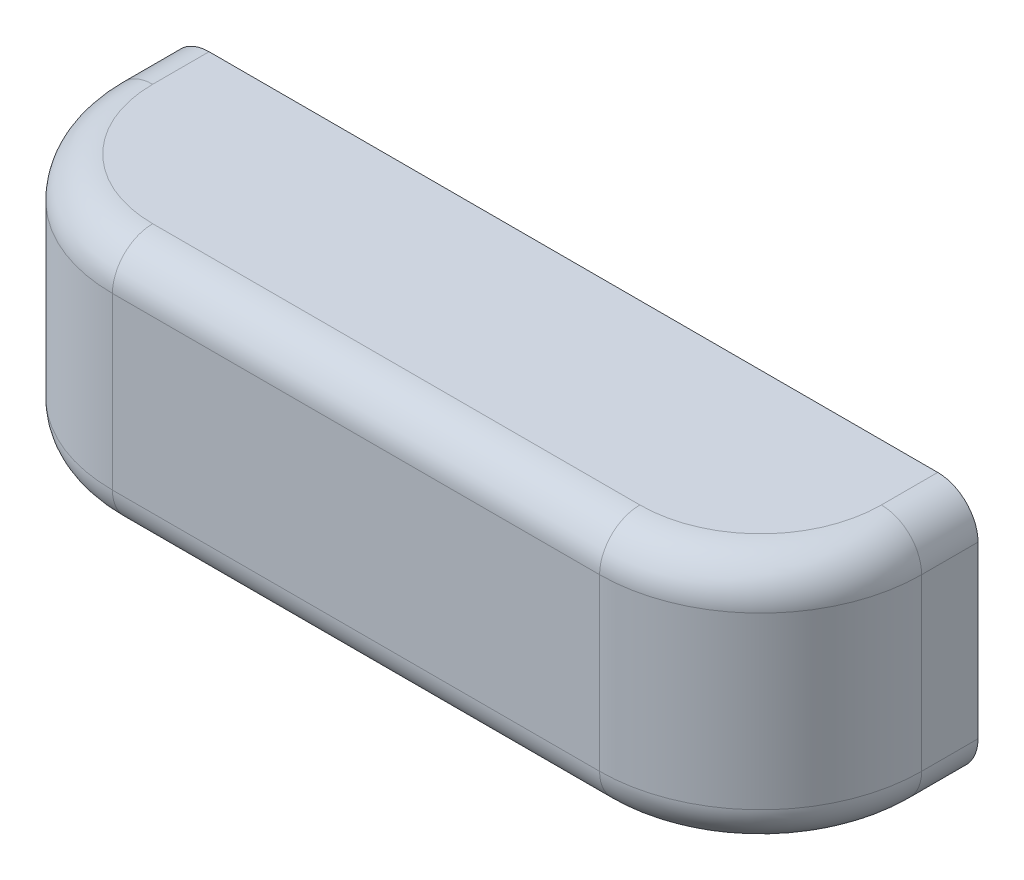
ISO-10303-21;
HEADER;
FILE_DESCRIPTION(('STEP AP214'),'2;1');
FILE_NAME('part.step','',(''),(''),'','','');
FILE_SCHEMA(('AUTOMOTIVE_DESIGN { 1 0 10303 214 1 1 1 1 }'));
ENDSEC;
DATA;
#1=APPLICATION_CONTEXT('core data for automotive mechanical design processes');
#2=APPLICATION_PROTOCOL_DEFINITION('international standard','automotive_design',2000,#1);
#3=PRODUCT_CONTEXT('',#1,'mechanical');
#4=PRODUCT('Part','Part','',(#3));
#5=PRODUCT_RELATED_PRODUCT_CATEGORY('part','',(#4));
#6=PRODUCT_DEFINITION_FORMATION('','',#4);
#7=PRODUCT_DEFINITION_CONTEXT('part definition',#1,'design');
#8=PRODUCT_DEFINITION('design','',#6,#7);
#9=PRODUCT_DEFINITION_SHAPE('','',#8);
#10=(LENGTH_UNIT() NAMED_UNIT(*) SI_UNIT(.MILLI.,.METRE.));
#11=(NAMED_UNIT(*) PLANE_ANGLE_UNIT() SI_UNIT($,.RADIAN.));
#12=(NAMED_UNIT(*) SI_UNIT($,.STERADIAN.) SOLID_ANGLE_UNIT());
#13=UNCERTAINTY_MEASURE_WITH_UNIT(LENGTH_MEASURE(1.E-05),#10,'distance_accuracy_value','');
#14=(GEOMETRIC_REPRESENTATION_CONTEXT(3) GLOBAL_UNCERTAINTY_ASSIGNED_CONTEXT((#13)) GLOBAL_UNIT_ASSIGNED_CONTEXT((#10,
#11,#12)) REPRESENTATION_CONTEXT('',''));
#15=CARTESIAN_POINT('',(0.,0.,0.));
#16=DIRECTION('',(0.,0.,1.));
#17=DIRECTION('',(1.,0.,0.));
#18=AXIS2_PLACEMENT_3D('',#15,#16,#17);
#19=CARTESIAN_POINT('',(50.25,15.575,27.));
#20=DIRECTION('',(-1.,0.,0.));
#21=DIRECTION('',(0.,0.,1.));
#22=AXIS2_PLACEMENT_3D('',#19,#20,#21);
#23=PLANE('',#22);
#24=DIRECTION('',(0.,1.,0.));
#25=VECTOR('',#24,1.);
#26=CARTESIAN_POINT('',(50.25,15.575,0.));
#27=LINE('',#26,#25);
#28=CARTESIAN_POINT('',(50.25,-10.575,0.));
#29=VERTEX_POINT('',#28);
#30=CARTESIAN_POINT('',(50.25,10.575,0.));
#31=VERTEX_POINT('',#30);
#32=EDGE_CURVE('E167',#29,#31,#27,.T.);
#33=ORIENTED_EDGE('',*,*,#32,.T.);
#34=DIRECTION('',(0.,0.,-1.));
#35=VECTOR('',#34,1.);
#36=CARTESIAN_POINT('',(50.25,10.575,27.));
#37=LINE('',#36,#35);
#38=CARTESIAN_POINT('',(50.25,10.575,7.));
#39=VERTEX_POINT('',#38);
#40=EDGE_CURVE('E142',#31,#39,#37,.F.);
#41=ORIENTED_EDGE('',*,*,#40,.T.);
#42=DIRECTION('',(0.,1.,0.));
#43=VECTOR('',#42,1.);
#44=CARTESIAN_POINT('',(50.25,-15.575,7.));
#45=LINE('',#44,#43);
#46=CARTESIAN_POINT('',(50.25,-10.575,7.));
#47=VERTEX_POINT('',#46);
#48=EDGE_CURVE('E187',#39,#47,#45,.F.);
#49=ORIENTED_EDGE('',*,*,#48,.T.);
#50=DIRECTION('',(0.,0.,-1.));
#51=VECTOR('',#50,1.);
#52=CARTESIAN_POINT('',(50.25,-10.575,27.));
#53=LINE('',#52,#51);
#54=EDGE_CURVE('E148',#47,#29,#53,.T.);
#55=ORIENTED_EDGE('',*,*,#54,.T.);
#56=EDGE_LOOP('',(#33,#41,#49,#55));
#57=FACE_BOUND('',#56,.T.);
#58=ADVANCED_FACE('F45',(#57),#23,.F.);
#59=CARTESIAN_POINT('',(-50.25,15.575,27.));
#60=DIRECTION('',(0.,-1.,0.));
#61=DIRECTION('',(0.,0.,-1.));
#62=AXIS2_PLACEMENT_3D('',#59,#60,#61);
#63=PLANE('',#62);
#64=CARTESIAN_POINT('',(30.25,15.575,7.));
#65=DIRECTION('',(0.,-1.,0.));
#66=DIRECTION('',(0.,0.,-1.));
#67=AXIS2_PLACEMENT_3D('',#64,#65,#66);
#68=CIRCLE('',#67,15.);
#69=CARTESIAN_POINT('',(30.25,15.575,22.));
#70=VERTEX_POINT('',#69);
#71=CARTESIAN_POINT('',(45.25,15.575,7.));
#72=VERTEX_POINT('',#71);
#73=EDGE_CURVE('E157',#70,#72,#68,.F.);
#74=ORIENTED_EDGE('',*,*,#73,.T.);
#75=DIRECTION('',(0.,0.,-1.));
#76=VECTOR('',#75,1.);
#77=CARTESIAN_POINT('',(45.25,15.575,27.));
#78=LINE('',#77,#76);
#79=CARTESIAN_POINT('',(45.25,15.575,0.));
#80=VERTEX_POINT('',#79);
#81=EDGE_CURVE('E141',#72,#80,#78,.T.);
#82=ORIENTED_EDGE('',*,*,#81,.T.);
#83=DIRECTION('',(-1.,0.,0.));
#84=VECTOR('',#83,1.);
#85=CARTESIAN_POINT('',(-50.25,15.575,0.));
#86=LINE('',#85,#84);
#87=CARTESIAN_POINT('',(-45.25,15.575,0.));
#88=VERTEX_POINT('',#87);
#89=EDGE_CURVE('E154',#80,#88,#86,.T.);
#90=ORIENTED_EDGE('',*,*,#89,.T.);
#91=DIRECTION('',(0.,0.,-1.));
#92=VECTOR('',#91,1.);
#93=CARTESIAN_POINT('',(-45.25,15.575,27.));
#94=LINE('',#93,#92);
#95=CARTESIAN_POINT('',(-45.25,15.575,7.));
#96=VERTEX_POINT('',#95);
#97=EDGE_CURVE('E201',#88,#96,#94,.F.);
#98=ORIENTED_EDGE('',*,*,#97,.T.);
#99=CARTESIAN_POINT('',(-30.25,15.575,7.));
#100=DIRECTION('',(0.,-1.,0.));
#101=DIRECTION('',(0.,0.,-1.));
#102=AXIS2_PLACEMENT_3D('',#99,#100,#101);
#103=CIRCLE('',#102,15.);
#104=CARTESIAN_POINT('',(-30.25,15.575,22.));
#105=VERTEX_POINT('',#104);
#106=EDGE_CURVE('E198',#96,#105,#103,.F.);
#107=ORIENTED_EDGE('',*,*,#106,.T.);
#108=DIRECTION('',(-1.,0.,0.));
#109=VECTOR('',#108,1.);
#110=CARTESIAN_POINT('',(30.25,15.575,22.));
#111=LINE('',#110,#109);
#112=EDGE_CURVE('E195',#105,#70,#111,.F.);
#113=ORIENTED_EDGE('',*,*,#112,.T.);
#114=EDGE_LOOP('',(#74,#82,#90,#98,#107,#113));
#115=FACE_BOUND('',#114,.T.);
#116=ADVANCED_FACE('F153',(#115),#63,.F.);
#117=CARTESIAN_POINT('',(-50.25,15.575,27.));
#118=DIRECTION('',(1.,0.,0.));
#119=DIRECTION('',(0.,1.,0.));
#120=AXIS2_PLACEMENT_3D('',#117,#118,#119);
#121=PLANE('',#120);
#122=DIRECTION('',(0.,-1.,0.));
#123=VECTOR('',#122,1.);
#124=CARTESIAN_POINT('',(-50.25,15.575,7.));
#125=LINE('',#124,#123);
#126=CARTESIAN_POINT('',(-50.25,-10.575,7.));
#127=VERTEX_POINT('',#126);
#128=CARTESIAN_POINT('',(-50.25,10.575,7.));
#129=VERTEX_POINT('',#128);
#130=EDGE_CURVE('E191',#127,#129,#125,.F.);
#131=ORIENTED_EDGE('',*,*,#130,.T.);
#132=DIRECTION('',(0.,0.,-1.));
#133=VECTOR('',#132,1.);
#134=CARTESIAN_POINT('',(-50.25,10.575,27.));
#135=LINE('',#134,#133);
#136=CARTESIAN_POINT('',(-50.25,10.575,0.));
#137=VERTEX_POINT('',#136);
#138=EDGE_CURVE('E226',#129,#137,#135,.T.);
#139=ORIENTED_EDGE('',*,*,#138,.T.);
#140=DIRECTION('',(0.,-1.,0.));
#141=VECTOR('',#140,1.);
#142=CARTESIAN_POINT('',(-50.25,15.575,0.));
#143=LINE('',#142,#141);
#144=CARTESIAN_POINT('',(-50.25,-10.575,0.));
#145=VERTEX_POINT('',#144);
#146=EDGE_CURVE('E166',#137,#145,#143,.T.);
#147=ORIENTED_EDGE('',*,*,#146,.T.);
#148=DIRECTION('',(0.,0.,-1.));
#149=VECTOR('',#148,1.);
#150=CARTESIAN_POINT('',(-50.25,-10.575,27.));
#151=LINE('',#150,#149);
#152=EDGE_CURVE('E223',#145,#127,#151,.F.);
#153=ORIENTED_EDGE('',*,*,#152,.T.);
#154=EDGE_LOOP('',(#131,#139,#147,#153));
#155=FACE_BOUND('',#154,.T.);
#156=ADVANCED_FACE('F296',(#155),#121,.F.);
#157=CARTESIAN_POINT('',(-50.25,-15.575,27.));
#158=DIRECTION('',(0.,1.,0.));
#159=DIRECTION('',(0.,0.,1.));
#160=AXIS2_PLACEMENT_3D('',#157,#158,#159);
#161=PLANE('',#160);
#162=CARTESIAN_POINT('',(-30.25,-15.575,7.));
#163=DIRECTION('',(0.,1.,0.));
#164=DIRECTION('',(0.,0.,1.));
#165=AXIS2_PLACEMENT_3D('',#162,#163,#164);
#166=CIRCLE('',#165,15.);
#167=CARTESIAN_POINT('',(-30.25,-15.575,22.));
#168=VERTEX_POINT('',#167);
#169=CARTESIAN_POINT('',(-45.25,-15.575,7.));
#170=VERTEX_POINT('',#169);
#171=EDGE_CURVE('E63',#168,#170,#166,.F.);
#172=ORIENTED_EDGE('',*,*,#171,.T.);
#173=DIRECTION('',(0.,0.,-1.));
#174=VECTOR('',#173,1.);
#175=CARTESIAN_POINT('',(-45.25,-15.575,27.));
#176=LINE('',#175,#174);
#177=CARTESIAN_POINT('',(-45.25,-15.575,0.));
#178=VERTEX_POINT('',#177);
#179=EDGE_CURVE('E245',#170,#178,#176,.T.);
#180=ORIENTED_EDGE('',*,*,#179,.T.);
#181=DIRECTION('',(1.,0.,0.));
#182=VECTOR('',#181,1.);
#183=CARTESIAN_POINT('',(-50.25,-15.575,0.));
#184=LINE('',#183,#182);
#185=CARTESIAN_POINT('',(45.25,-15.575,0.));
#186=VERTEX_POINT('',#185);
#187=EDGE_CURVE('E172',#178,#186,#184,.T.);
#188=ORIENTED_EDGE('',*,*,#187,.T.);
#189=DIRECTION('',(0.,0.,-1.));
#190=VECTOR('',#189,1.);
#191=CARTESIAN_POINT('',(45.25,-15.575,27.));
#192=LINE('',#191,#190);
#193=CARTESIAN_POINT('',(45.25,-15.575,7.));
#194=VERTEX_POINT('',#193);
#195=EDGE_CURVE('E70',#186,#194,#192,.F.);
#196=ORIENTED_EDGE('',*,*,#195,.T.);
#197=CARTESIAN_POINT('',(30.25,-15.575,7.));
#198=DIRECTION('',(0.,1.,0.));
#199=DIRECTION('',(0.,0.,1.));
#200=AXIS2_PLACEMENT_3D('',#197,#198,#199);
#201=CIRCLE('',#200,15.);
#202=CARTESIAN_POINT('',(30.25,-15.575,22.));
#203=VERTEX_POINT('',#202);
#204=EDGE_CURVE('E238',#194,#203,#201,.F.);
#205=ORIENTED_EDGE('',*,*,#204,.T.);
#206=DIRECTION('',(1.,0.,0.));
#207=VECTOR('',#206,1.);
#208=CARTESIAN_POINT('',(-30.25,-15.575,22.));
#209=LINE('',#208,#207);
#210=EDGE_CURVE('E235',#203,#168,#209,.F.);
#211=ORIENTED_EDGE('',*,*,#210,.T.);
#212=EDGE_LOOP('',(#172,#180,#188,#196,#205,#211));
#213=FACE_BOUND('',#212,.T.);
#214=ADVANCED_FACE('F290',(#213),#161,.F.);
#215=CARTESIAN_POINT('',(0.,0.,27.));
#216=DIRECTION('',(0.,0.,1.));
#217=DIRECTION('',(1.,0.,0.));
#218=AXIS2_PLACEMENT_3D('',#215,#216,#217);
#219=PLANE('',#218);
#220=DIRECTION('',(0.,1.,0.));
#221=VECTOR('',#220,1.);
#222=CARTESIAN_POINT('',(30.25,15.575,27.));
#223=LINE('',#222,#221);
#224=CARTESIAN_POINT('',(30.25,-10.575,27.));
#225=VERTEX_POINT('',#224);
#226=CARTESIAN_POINT('',(30.25,10.575,27.));
#227=VERTEX_POINT('',#226);
#228=EDGE_CURVE('E183',#225,#227,#223,.T.);
#229=ORIENTED_EDGE('',*,*,#228,.T.);
#230=DIRECTION('',(-1.,0.,0.));
#231=VECTOR('',#230,1.);
#232=CARTESIAN_POINT('',(-30.25,10.575,27.));
#233=LINE('',#232,#231);
#234=CARTESIAN_POINT('',(-30.25,10.575,27.));
#235=VERTEX_POINT('',#234);
#236=EDGE_CURVE('E11',#227,#235,#233,.T.);
#237=ORIENTED_EDGE('',*,*,#236,.T.);
#238=DIRECTION('',(0.,-1.,0.));
#239=VECTOR('',#238,1.);
#240=CARTESIAN_POINT('',(-30.25,-15.575,27.));
#241=LINE('',#240,#239);
#242=CARTESIAN_POINT('',(-30.25,-10.575,27.));
#243=VERTEX_POINT('',#242);
#244=EDGE_CURVE('E179',#235,#243,#241,.T.);
#245=ORIENTED_EDGE('',*,*,#244,.T.);
#246=DIRECTION('',(1.,0.,0.));
#247=VECTOR('',#246,1.);
#248=CARTESIAN_POINT('',(30.25,-10.575,27.));
#249=LINE('',#248,#247);
#250=EDGE_CURVE('E55',#243,#225,#249,.T.);
#251=ORIENTED_EDGE('',*,*,#250,.T.);
#252=EDGE_LOOP('',(#229,#237,#245,#251));
#253=FACE_BOUND('',#252,.T.);
#254=ADVANCED_FACE('F319',(#253),#219,.T.);
#255=CARTESIAN_POINT('',(0.,0.,0.));
#256=DIRECTION('',(0.,0.,1.));
#257=DIRECTION('',(1.,0.,0.));
#258=AXIS2_PLACEMENT_3D('',#255,#256,#257);
#259=PLANE('',#258);
#260=ORIENTED_EDGE('',*,*,#89,.F.);
#261=CARTESIAN_POINT('',(45.25,10.575,0.));
#262=DIRECTION('',(0.,0.,1.));
#263=DIRECTION('',(1.,0.,0.));
#264=AXIS2_PLACEMENT_3D('',#261,#262,#263);
#265=CIRCLE('',#264,5.);
#266=EDGE_CURVE('E137',#80,#31,#265,.F.);
#267=ORIENTED_EDGE('',*,*,#266,.T.);
#268=ORIENTED_EDGE('',*,*,#32,.F.);
#269=CARTESIAN_POINT('',(45.25,-10.575,0.));
#270=DIRECTION('',(0.,0.,1.));
#271=DIRECTION('',(1.,0.,0.));
#272=AXIS2_PLACEMENT_3D('',#269,#270,#271);
#273=CIRCLE('',#272,5.);
#274=EDGE_CURVE('E160',#29,#186,#273,.F.);
#275=ORIENTED_EDGE('',*,*,#274,.T.);
#276=ORIENTED_EDGE('',*,*,#187,.F.);
#277=CARTESIAN_POINT('',(-45.25,-10.575,0.));
#278=DIRECTION('',(0.,0.,1.));
#279=DIRECTION('',(1.,0.,0.));
#280=AXIS2_PLACEMENT_3D('',#277,#278,#279);
#281=CIRCLE('',#280,5.);
#282=EDGE_CURVE('E208',#178,#145,#281,.F.);
#283=ORIENTED_EDGE('',*,*,#282,.T.);
#284=ORIENTED_EDGE('',*,*,#146,.F.);
#285=CARTESIAN_POINT('',(-45.25,10.575,0.));
#286=DIRECTION('',(0.,0.,1.));
#287=DIRECTION('',(1.,0.,0.));
#288=AXIS2_PLACEMENT_3D('',#285,#286,#287);
#289=CIRCLE('',#288,5.);
#290=EDGE_CURVE('E149',#137,#88,#289,.F.);
#291=ORIENTED_EDGE('',*,*,#290,.T.);
#292=EDGE_LOOP('',(#260,#267,#268,#275,#276,#283,#284,#291));
#293=FACE_BOUND('',#292,.T.);
#294=ADVANCED_FACE('F162',(#293),#259,.F.);
#295=CARTESIAN_POINT('',(30.25,0.,7.));
#296=DIRECTION('',(0.,-1.,0.));
#297=DIRECTION('',(0.,0.,-1.));
#298=AXIS2_PLACEMENT_3D('',#295,#296,#297);
#299=CYLINDRICAL_SURFACE('',#298,20.);
#300=ORIENTED_EDGE('',*,*,#48,.F.);
#301=CARTESIAN_POINT('',(30.25,10.575,7.));
#302=DIRECTION('',(0.,-1.,0.));
#303=DIRECTION('',(0.,0.,-1.));
#304=AXIS2_PLACEMENT_3D('',#301,#302,#303);
#305=CIRCLE('',#304,20.);
#306=EDGE_CURVE('E220',#39,#227,#305,.T.);
#307=ORIENTED_EDGE('',*,*,#306,.T.);
#308=ORIENTED_EDGE('',*,*,#228,.F.);
#309=CARTESIAN_POINT('',(30.25,-10.575,7.));
#310=DIRECTION('',(0.,1.,0.));
#311=DIRECTION('',(0.,0.,1.));
#312=AXIS2_PLACEMENT_3D('',#309,#310,#311);
#313=CIRCLE('',#312,20.);
#314=EDGE_CURVE('E217',#225,#47,#313,.T.);
#315=ORIENTED_EDGE('',*,*,#314,.T.);
#316=EDGE_LOOP('',(#300,#307,#308,#315));
#317=FACE_BOUND('',#316,.T.);
#318=ADVANCED_FACE('F317',(#317),#299,.T.);
#319=CARTESIAN_POINT('',(-30.25,0.,7.));
#320=DIRECTION('',(0.,1.,0.));
#321=DIRECTION('',(-1.,0.,0.));
#322=AXIS2_PLACEMENT_3D('',#319,#320,#321);
#323=CYLINDRICAL_SURFACE('',#322,20.);
#324=ORIENTED_EDGE('',*,*,#244,.F.);
#325=CARTESIAN_POINT('',(-30.25,10.575,7.));
#326=DIRECTION('',(0.,-1.,0.));
#327=DIRECTION('',(0.,0.,-1.));
#328=AXIS2_PLACEMENT_3D('',#325,#326,#327);
#329=CIRCLE('',#328,20.);
#330=EDGE_CURVE('E232',#235,#129,#329,.T.);
#331=ORIENTED_EDGE('',*,*,#330,.T.);
#332=ORIENTED_EDGE('',*,*,#130,.F.);
#333=CARTESIAN_POINT('',(-30.25,-10.575,7.));
#334=DIRECTION('',(0.,1.,0.));
#335=DIRECTION('',(0.,0.,1.));
#336=AXIS2_PLACEMENT_3D('',#333,#334,#335);
#337=CIRCLE('',#336,20.);
#338=EDGE_CURVE('E229',#127,#243,#337,.T.);
#339=ORIENTED_EDGE('',*,*,#338,.T.);
#340=EDGE_LOOP('',(#324,#331,#332,#339));
#341=FACE_BOUND('',#340,.T.);
#342=ADVANCED_FACE('F327',(#341),#323,.T.);
#343=CARTESIAN_POINT('',(-45.25,10.575,27.));
#344=DIRECTION('',(0.,0.,-1.));
#345=DIRECTION('',(-1.,0.,0.));
#346=AXIS2_PLACEMENT_3D('',#343,#344,#345);
#347=CYLINDRICAL_SURFACE('',#346,5.);
#348=ORIENTED_EDGE('',*,*,#290,.F.);
#349=ORIENTED_EDGE('',*,*,#138,.F.);
#350=CARTESIAN_POINT('',(-45.25,10.575,7.));
#351=DIRECTION('',(0.,0.,1.));
#352=DIRECTION('',(1.,0.,0.));
#353=AXIS2_PLACEMENT_3D('',#350,#351,#352);
#354=CIRCLE('',#353,5.);
#355=EDGE_CURVE('E174',#96,#129,#354,.T.);
#356=ORIENTED_EDGE('',*,*,#355,.F.);
#357=ORIENTED_EDGE('',*,*,#97,.F.);
#358=EDGE_LOOP('',(#348,#349,#356,#357));
#359=FACE_BOUND('',#358,.T.);
#360=ADVANCED_FACE('F301',(#359),#347,.T.);
#361=CARTESIAN_POINT('',(-30.25,10.575,7.));
#362=DIRECTION('',(0.,-1.,0.));
#363=DIRECTION('',(0.,0.,-1.));
#364=AXIS2_PLACEMENT_3D('',#361,#362,#363);
#365=TOROIDAL_SURFACE('',#364,15.,5.);
#366=ORIENTED_EDGE('',*,*,#355,.T.);
#367=ORIENTED_EDGE('',*,*,#330,.F.);
#368=CARTESIAN_POINT('',(-30.25,10.575,22.));
#369=DIRECTION('',(1.,0.,0.));
#370=DIRECTION('',(0.,0.,-1.));
#371=AXIS2_PLACEMENT_3D('',#368,#369,#370);
#372=CIRCLE('',#371,5.);
#373=EDGE_CURVE('E257',#105,#235,#372,.T.);
#374=ORIENTED_EDGE('',*,*,#373,.F.);
#375=ORIENTED_EDGE('',*,*,#106,.F.);
#376=EDGE_LOOP('',(#366,#367,#374,#375));
#377=FACE_BOUND('',#376,.T.);
#378=ADVANCED_FACE('F305',(#377),#365,.T.);
#379=CARTESIAN_POINT('',(0.,10.575,22.));
#380=DIRECTION('',(1.,0.,0.));
#381=DIRECTION('',(0.,0.,-1.));
#382=AXIS2_PLACEMENT_3D('',#379,#380,#381);
#383=CYLINDRICAL_SURFACE('',#382,5.);
#384=ORIENTED_EDGE('',*,*,#373,.T.);
#385=ORIENTED_EDGE('',*,*,#236,.F.);
#386=CARTESIAN_POINT('',(30.25,10.575,22.));
#387=DIRECTION('',(1.,0.,0.));
#388=DIRECTION('',(0.,0.,-1.));
#389=AXIS2_PLACEMENT_3D('',#386,#387,#388);
#390=CIRCLE('',#389,5.);
#391=EDGE_CURVE('E253',#70,#227,#390,.T.);
#392=ORIENTED_EDGE('',*,*,#391,.F.);
#393=ORIENTED_EDGE('',*,*,#112,.F.);
#394=EDGE_LOOP('',(#384,#385,#392,#393));
#395=FACE_BOUND('',#394,.T.);
#396=ADVANCED_FACE('F311',(#395),#383,.T.);
#397=CARTESIAN_POINT('',(30.25,10.575,7.));
#398=DIRECTION('',(0.,-1.,0.));
#399=DIRECTION('',(0.,0.,-1.));
#400=AXIS2_PLACEMENT_3D('',#397,#398,#399);
#401=TOROIDAL_SURFACE('',#400,15.,5.);
#402=ORIENTED_EDGE('',*,*,#391,.T.);
#403=ORIENTED_EDGE('',*,*,#306,.F.);
#404=CARTESIAN_POINT('',(45.25,10.575,7.));
#405=DIRECTION('',(0.,0.,-1.));
#406=DIRECTION('',(-1.,0.,0.));
#407=AXIS2_PLACEMENT_3D('',#404,#405,#406);
#408=CIRCLE('',#407,5.);
#409=EDGE_CURVE('E250',#72,#39,#408,.T.);
#410=ORIENTED_EDGE('',*,*,#409,.F.);
#411=ORIENTED_EDGE('',*,*,#73,.F.);
#412=EDGE_LOOP('',(#402,#403,#410,#411));
#413=FACE_BOUND('',#412,.T.);
#414=ADVANCED_FACE('F314',(#413),#401,.T.);
#415=CARTESIAN_POINT('',(45.25,10.575,27.));
#416=DIRECTION('',(0.,0.,-1.));
#417=DIRECTION('',(-1.,0.,0.));
#418=AXIS2_PLACEMENT_3D('',#415,#416,#417);
#419=CYLINDRICAL_SURFACE('',#418,5.);
#420=ORIENTED_EDGE('',*,*,#409,.T.);
#421=ORIENTED_EDGE('',*,*,#40,.F.);
#422=ORIENTED_EDGE('',*,*,#266,.F.);
#423=ORIENTED_EDGE('',*,*,#81,.F.);
#424=EDGE_LOOP('',(#420,#421,#422,#423));
#425=FACE_BOUND('',#424,.T.);
#426=ADVANCED_FACE('F140',(#425),#419,.T.);
#427=CARTESIAN_POINT('',(45.25,-10.575,27.));
#428=DIRECTION('',(0.,0.,-1.));
#429=DIRECTION('',(-1.,0.,0.));
#430=AXIS2_PLACEMENT_3D('',#427,#428,#429);
#431=CYLINDRICAL_SURFACE('',#430,5.);
#432=ORIENTED_EDGE('',*,*,#274,.F.);
#433=ORIENTED_EDGE('',*,*,#54,.F.);
#434=CARTESIAN_POINT('',(45.25,-10.575,7.));
#435=DIRECTION('',(0.,0.,1.));
#436=DIRECTION('',(1.,0.,0.));
#437=AXIS2_PLACEMENT_3D('',#434,#435,#436);
#438=CIRCLE('',#437,5.);
#439=EDGE_CURVE('E49',#194,#47,#438,.T.);
#440=ORIENTED_EDGE('',*,*,#439,.F.);
#441=ORIENTED_EDGE('',*,*,#195,.F.);
#442=EDGE_LOOP('',(#432,#433,#440,#441));
#443=FACE_BOUND('',#442,.T.);
#444=ADVANCED_FACE('F47',(#443),#431,.T.);
#445=CARTESIAN_POINT('',(30.25,-10.575,7.));
#446=DIRECTION('',(0.,1.,0.));
#447=DIRECTION('',(0.,0.,1.));
#448=AXIS2_PLACEMENT_3D('',#445,#446,#447);
#449=TOROIDAL_SURFACE('',#448,15.,5.);
#450=ORIENTED_EDGE('',*,*,#439,.T.);
#451=ORIENTED_EDGE('',*,*,#314,.F.);
#452=CARTESIAN_POINT('',(30.25,-10.575,22.));
#453=DIRECTION('',(-1.,0.,0.));
#454=DIRECTION('',(0.,0.,1.));
#455=AXIS2_PLACEMENT_3D('',#452,#453,#454);
#456=CIRCLE('',#455,5.);
#457=EDGE_CURVE('E271',#203,#225,#456,.T.);
#458=ORIENTED_EDGE('',*,*,#457,.F.);
#459=ORIENTED_EDGE('',*,*,#204,.F.);
#460=EDGE_LOOP('',(#450,#451,#458,#459));
#461=FACE_BOUND('',#460,.T.);
#462=ADVANCED_FACE('F283',(#461),#449,.T.);
#463=CARTESIAN_POINT('',(0.,-10.575,22.));
#464=DIRECTION('',(-1.,0.,0.));
#465=DIRECTION('',(0.,0.,1.));
#466=AXIS2_PLACEMENT_3D('',#463,#464,#465);
#467=CYLINDRICAL_SURFACE('',#466,5.);
#468=ORIENTED_EDGE('',*,*,#457,.T.);
#469=ORIENTED_EDGE('',*,*,#250,.F.);
#470=CARTESIAN_POINT('',(-30.25,-10.575,22.));
#471=DIRECTION('',(-1.,0.,0.));
#472=DIRECTION('',(0.,0.,1.));
#473=AXIS2_PLACEMENT_3D('',#470,#471,#472);
#474=CIRCLE('',#473,5.);
#475=EDGE_CURVE('E268',#168,#243,#474,.T.);
#476=ORIENTED_EDGE('',*,*,#475,.F.);
#477=ORIENTED_EDGE('',*,*,#210,.F.);
#478=EDGE_LOOP('',(#468,#469,#476,#477));
#479=FACE_BOUND('',#478,.T.);
#480=ADVANCED_FACE('F322',(#479),#467,.T.);
#481=CARTESIAN_POINT('',(-30.25,-10.575,7.));
#482=DIRECTION('',(0.,1.,0.));
#483=DIRECTION('',(0.,0.,1.));
#484=AXIS2_PLACEMENT_3D('',#481,#482,#483);
#485=TOROIDAL_SURFACE('',#484,15.,5.);
#486=ORIENTED_EDGE('',*,*,#475,.T.);
#487=ORIENTED_EDGE('',*,*,#338,.F.);
#488=CARTESIAN_POINT('',(-45.25,-10.575,7.));
#489=DIRECTION('',(0.,0.,-1.));
#490=DIRECTION('',(-1.,0.,0.));
#491=AXIS2_PLACEMENT_3D('',#488,#489,#490);
#492=CIRCLE('',#491,5.);
#493=EDGE_CURVE('E264',#170,#127,#492,.T.);
#494=ORIENTED_EDGE('',*,*,#493,.F.);
#495=ORIENTED_EDGE('',*,*,#171,.F.);
#496=EDGE_LOOP('',(#486,#487,#494,#495));
#497=FACE_BOUND('',#496,.T.);
#498=ADVANCED_FACE('F325',(#497),#485,.T.);
#499=CARTESIAN_POINT('',(-45.25,-10.575,27.));
#500=DIRECTION('',(0.,0.,-1.));
#501=DIRECTION('',(-1.,0.,0.));
#502=AXIS2_PLACEMENT_3D('',#499,#500,#501);
#503=CYLINDRICAL_SURFACE('',#502,5.);
#504=ORIENTED_EDGE('',*,*,#493,.T.);
#505=ORIENTED_EDGE('',*,*,#152,.F.);
#506=ORIENTED_EDGE('',*,*,#282,.F.);
#507=ORIENTED_EDGE('',*,*,#179,.F.);
#508=EDGE_LOOP('',(#504,#505,#506,#507));
#509=FACE_BOUND('',#508,.T.);
#510=ADVANCED_FACE('F293',(#509),#503,.T.);
#511=CLOSED_SHELL('',(#58,#116,#156,#214,#254,#294,#318,#342,#360,#378,#396,#414,#426,#444,#462,
#480,#498,#510));
#512=MANIFOLD_SOLID_BREP('B2',#511);
#513=ADVANCED_BREP_SHAPE_REPRESENTATION('',(#18,#512),#14);
#514=SHAPE_DEFINITION_REPRESENTATION(#9,#513);
ENDSEC;
END-ISO-10303-21;
